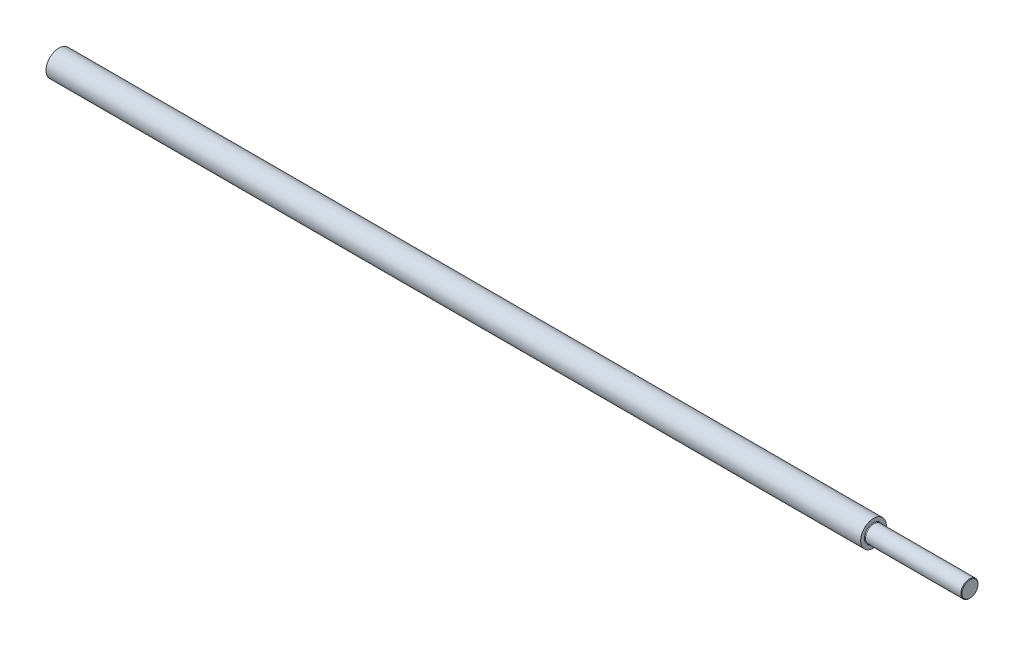
ISO-10303-21;
HEADER;
FILE_DESCRIPTION(('STEP AP214'),'2;1');
FILE_NAME('part.step','',(''),(''),'','','');
FILE_SCHEMA(('AUTOMOTIVE_DESIGN { 1 0 10303 214 1 1 1 1 }'));
ENDSEC;
DATA;
#1=APPLICATION_CONTEXT('core data for automotive mechanical design processes');
#2=APPLICATION_PROTOCOL_DEFINITION('international standard','automotive_design',2000,#1);
#3=PRODUCT_CONTEXT('',#1,'mechanical');
#4=PRODUCT('Part','Part','',(#3));
#5=PRODUCT_RELATED_PRODUCT_CATEGORY('part','',(#4));
#6=PRODUCT_DEFINITION_FORMATION('','',#4);
#7=PRODUCT_DEFINITION_CONTEXT('part definition',#1,'design');
#8=PRODUCT_DEFINITION('design','',#6,#7);
#9=PRODUCT_DEFINITION_SHAPE('','',#8);
#10=(LENGTH_UNIT() NAMED_UNIT(*) SI_UNIT(.MILLI.,.METRE.));
#11=(NAMED_UNIT(*) PLANE_ANGLE_UNIT() SI_UNIT($,.RADIAN.));
#12=(NAMED_UNIT(*) SI_UNIT($,.STERADIAN.) SOLID_ANGLE_UNIT());
#13=UNCERTAINTY_MEASURE_WITH_UNIT(LENGTH_MEASURE(1.E-05),#10,'distance_accuracy_value','');
#14=(GEOMETRIC_REPRESENTATION_CONTEXT(3) GLOBAL_UNCERTAINTY_ASSIGNED_CONTEXT((#13)) GLOBAL_UNIT_ASSIGNED_CONTEXT((#10,
#11,#12)) REPRESENTATION_CONTEXT('',''));
#15=CARTESIAN_POINT('',(0.,0.,0.));
#16=DIRECTION('',(0.,0.,1.));
#17=DIRECTION('',(1.,0.,0.));
#18=AXIS2_PLACEMENT_3D('',#15,#16,#17);
#19=CARTESIAN_POINT('',(425.,3.73333333333329,0.));
#20=DIRECTION('',(-1.,0.,0.));
#21=DIRECTION('',(0.,-1.,0.));
#22=AXIS2_PLACEMENT_3D('',#19,#20,#21);
#23=PLANE('',#22);
#24=CARTESIAN_POINT('',(425.,0.,0.));
#25=DIRECTION('',(-1.,0.,0.));
#26=DIRECTION('',(0.,-1.,0.));
#27=AXIS2_PLACEMENT_3D('',#24,#25,#26);
#28=CIRCLE('',#27,3.73333333333326);
#29=CARTESIAN_POINT('',(425.,-3.73333333333322,0.));
#30=VERTEX_POINT('',#29);
#31=EDGE_CURVE('E10',#30,#30,#28,.T.);
#32=ORIENTED_EDGE('',*,*,#31,.F.);
#33=EDGE_LOOP('',(#32));
#34=FACE_BOUND('',#33,.T.);
#35=ADVANCED_FACE('F35',(#34),#23,.F.);
#36=CARTESIAN_POINT('',(425.,0.,0.));
#37=DIRECTION('',(-1.,0.,0.));
#38=DIRECTION('',(0.,-1.,0.));
#39=AXIS2_PLACEMENT_3D('',#36,#37,#38);
#40=CONICAL_SURFACE('',#39,3.73333333333326,0.785398163391325);
#41=CARTESIAN_POINT('',(424.73333333333,0.,0.));
#42=DIRECTION('',(-1.,0.,0.));
#43=DIRECTION('',(0.,-1.,0.));
#44=AXIS2_PLACEMENT_3D('',#41,#42,#43);
#45=CIRCLE('',#44,3.99999999999996);
#46=CARTESIAN_POINT('',(424.73333333333,-3.99999999999992,0.));
#47=VERTEX_POINT('',#46);
#48=EDGE_CURVE('E41',#47,#47,#45,.T.);
#49=ORIENTED_EDGE('',*,*,#48,.F.);
#50=EDGE_LOOP('',(#49));
#51=FACE_BOUND('',#50,.T.);
#52=ORIENTED_EDGE('',*,*,#31,.T.);
#53=EDGE_LOOP('',(#52));
#54=FACE_BOUND('',#53,.T.);
#55=ADVANCED_FACE('F83',(#51,#54),#40,.T.);
#56=CARTESIAN_POINT('',(425.,0.,0.));
#57=DIRECTION('',(-1.,0.,0.));
#58=DIRECTION('',(0.,-1.,0.));
#59=AXIS2_PLACEMENT_3D('',#56,#57,#58);
#60=CYLINDRICAL_SURFACE('',#59,3.99999999999994);
#61=CARTESIAN_POINT('',(380.299999999993,0.,0.));
#62=DIRECTION('',(-1.,0.,0.));
#63=DIRECTION('',(0.,-1.,0.));
#64=AXIS2_PLACEMENT_3D('',#61,#62,#63);
#65=CIRCLE('',#64,3.99999999999992);
#66=CARTESIAN_POINT('',(380.299999999993,-3.99999999999989,0.));
#67=VERTEX_POINT('',#66);
#68=EDGE_CURVE('E45',#67,#67,#65,.T.);
#69=ORIENTED_EDGE('',*,*,#68,.F.);
#70=EDGE_LOOP('',(#69));
#71=FACE_BOUND('',#70,.T.);
#72=ORIENTED_EDGE('',*,*,#48,.T.);
#73=EDGE_LOOP('',(#72));
#74=FACE_BOUND('',#73,.T.);
#75=ADVANCED_FACE('F78',(#71,#74),#60,.T.);
#76=CARTESIAN_POINT('',(380.299999999993,0.,0.));
#77=DIRECTION('',(-1.,0.,0.));
#78=DIRECTION('',(0.,-1.,0.));
#79=AXIS2_PLACEMENT_3D('',#76,#77,#78);
#80=TOROIDAL_SURFACE('',#79,4.29999999999308,0.299999999993155);
#81=CARTESIAN_POINT('',(380.,0.,0.));
#82=DIRECTION('',(-1.,0.,0.));
#83=DIRECTION('',(0.,-1.,0.));
#84=AXIS2_PLACEMENT_3D('',#81,#82,#83);
#85=CIRCLE('',#84,4.29999999999308);
#86=CARTESIAN_POINT('',(380.,-4.29999999999304,0.));
#87=VERTEX_POINT('',#86);
#88=EDGE_CURVE('E49',#87,#87,#85,.T.);
#89=ORIENTED_EDGE('',*,*,#88,.F.);
#90=EDGE_LOOP('',(#89));
#91=FACE_BOUND('',#90,.T.);
#92=ORIENTED_EDGE('',*,*,#68,.T.);
#93=EDGE_LOOP('',(#92));
#94=FACE_BOUND('',#93,.T.);
#95=ADVANCED_FACE('F72',(#91,#94),#80,.F.);
#96=CARTESIAN_POINT('',(380.,6.,0.));
#97=DIRECTION('',(-1.,0.,0.));
#98=DIRECTION('',(0.,-1.,0.));
#99=AXIS2_PLACEMENT_3D('',#96,#97,#98);
#100=PLANE('',#99);
#101=CARTESIAN_POINT('',(380.,0.,0.));
#102=DIRECTION('',(-1.,0.,0.));
#103=DIRECTION('',(0.,-1.,0.));
#104=AXIS2_PLACEMENT_3D('',#101,#102,#103);
#105=CIRCLE('',#104,5.99999999999997);
#106=CARTESIAN_POINT('',(380.,-5.99999999999993,0.));
#107=VERTEX_POINT('',#106);
#108=EDGE_CURVE('E54',#107,#107,#105,.T.);
#109=ORIENTED_EDGE('',*,*,#108,.F.);
#110=EDGE_LOOP('',(#109));
#111=FACE_BOUND('',#110,.T.);
#112=ORIENTED_EDGE('',*,*,#88,.T.);
#113=EDGE_LOOP('',(#112));
#114=FACE_BOUND('',#113,.T.);
#115=ADVANCED_FACE('F66',(#111,#114),#100,.F.);
#116=CARTESIAN_POINT('',(425.,0.,0.));
#117=DIRECTION('',(-1.,0.,0.));
#118=DIRECTION('',(0.,-1.,0.));
#119=AXIS2_PLACEMENT_3D('',#116,#117,#118);
#120=CYLINDRICAL_SURFACE('',#119,5.99999999999998);
#121=CARTESIAN_POINT('',(0.,0.,0.));
#122=DIRECTION('',(-1.,0.,0.));
#123=DIRECTION('',(0.,-1.,0.));
#124=AXIS2_PLACEMENT_3D('',#121,#122,#123);
#125=CIRCLE('',#124,6.);
#126=CARTESIAN_POINT('',(0.,-6.,0.));
#127=VERTEX_POINT('',#126);
#128=EDGE_CURVE('E57',#127,#127,#125,.T.);
#129=ORIENTED_EDGE('',*,*,#128,.F.);
#130=EDGE_LOOP('',(#129));
#131=FACE_BOUND('',#130,.T.);
#132=ORIENTED_EDGE('',*,*,#108,.T.);
#133=EDGE_LOOP('',(#132));
#134=FACE_BOUND('',#133,.T.);
#135=ADVANCED_FACE('F63',(#131,#134),#120,.T.);
#136=CARTESIAN_POINT('',(0.,0.,0.));
#137=DIRECTION('',(1.,0.,0.));
#138=DIRECTION('',(0.,1.,0.));
#139=AXIS2_PLACEMENT_3D('',#136,#137,#138);
#140=PLANE('',#139);
#141=ORIENTED_EDGE('',*,*,#128,.T.);
#142=EDGE_LOOP('',(#141));
#143=FACE_BOUND('',#142,.T.);
#144=ADVANCED_FACE('F61',(#143),#140,.F.);
#145=CLOSED_SHELL('',(#35,#55,#75,#95,#115,#135,#144));
#146=MANIFOLD_SOLID_BREP('B2',#145);
#147=ADVANCED_BREP_SHAPE_REPRESENTATION('',(#18,#146),#14);
#148=SHAPE_DEFINITION_REPRESENTATION(#9,#147);
ENDSEC;
END-ISO-10303-21;
